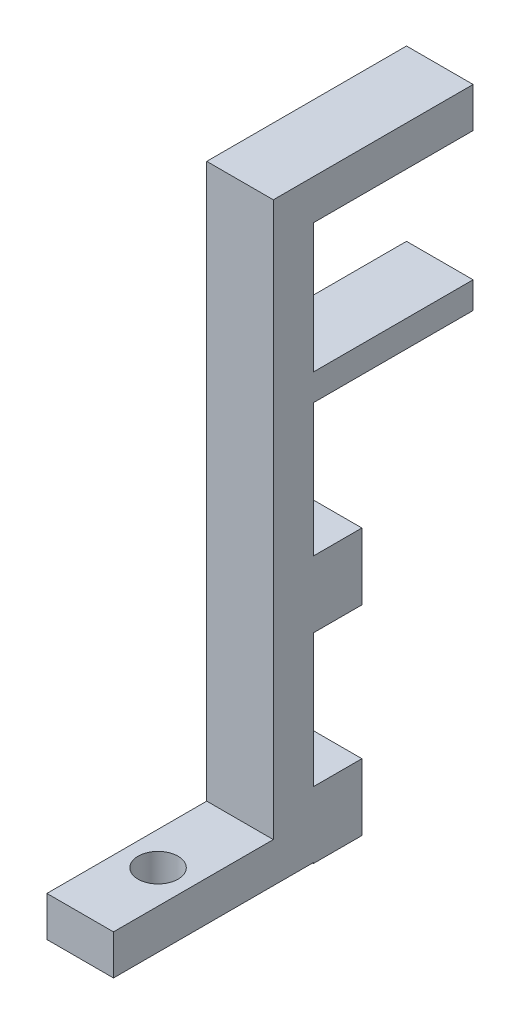
ISO-10303-21;
HEADER;
FILE_DESCRIPTION(('STEP AP214'),'2;1');
FILE_NAME('part.step','',(''),(''),'','','');
FILE_SCHEMA(('AUTOMOTIVE_DESIGN { 1 0 10303 214 1 1 1 1 }'));
ENDSEC;
DATA;
#1=APPLICATION_CONTEXT('core data for automotive mechanical design processes');
#2=APPLICATION_PROTOCOL_DEFINITION('international standard','automotive_design',2000,#1);
#3=PRODUCT_CONTEXT('',#1,'mechanical');
#4=PRODUCT('Part','Part','',(#3));
#5=PRODUCT_RELATED_PRODUCT_CATEGORY('part','',(#4));
#6=PRODUCT_DEFINITION_FORMATION('','',#4);
#7=PRODUCT_DEFINITION_CONTEXT('part definition',#1,'design');
#8=PRODUCT_DEFINITION('design','',#6,#7);
#9=PRODUCT_DEFINITION_SHAPE('','',#8);
#10=(LENGTH_UNIT() NAMED_UNIT(*) SI_UNIT(.MILLI.,.METRE.));
#11=(NAMED_UNIT(*) PLANE_ANGLE_UNIT() SI_UNIT($,.RADIAN.));
#12=(NAMED_UNIT(*) SI_UNIT($,.STERADIAN.) SOLID_ANGLE_UNIT());
#13=UNCERTAINTY_MEASURE_WITH_UNIT(LENGTH_MEASURE(1.E-05),#10,'distance_accuracy_value','');
#14=(GEOMETRIC_REPRESENTATION_CONTEXT(3) GLOBAL_UNCERTAINTY_ASSIGNED_CONTEXT((#13)) GLOBAL_UNIT_ASSIGNED_CONTEXT((#10,
#11,#12)) REPRESENTATION_CONTEXT('',''));
#15=CARTESIAN_POINT('',(0.,0.,0.));
#16=DIRECTION('',(0.,0.,1.));
#17=DIRECTION('',(1.,0.,0.));
#18=AXIS2_PLACEMENT_3D('',#15,#16,#17);
#19=CARTESIAN_POINT('',(0.,0.,0.));
#20=DIRECTION('',(0.,0.,1.));
#21=DIRECTION('',(1.,0.,0.));
#22=AXIS2_PLACEMENT_3D('',#19,#20,#21);
#23=PLANE('',#22);
#24=DIRECTION('',(1.,0.,0.));
#25=VECTOR('',#24,1.);
#26=CARTESIAN_POINT('',(2.5,-17.3642505571034,0.));
#27=LINE('',#26,#25);
#28=CARTESIAN_POINT('',(-2.5,-17.3642505571034,0.));
#29=VERTEX_POINT('',#28);
#30=CARTESIAN_POINT('',(2.5,-17.3642505571034,0.));
#31=VERTEX_POINT('',#30);
#32=EDGE_CURVE('E183',#29,#31,#27,.T.);
#33=ORIENTED_EDGE('',*,*,#32,.F.);
#34=DIRECTION('',(0.,-1.,0.));
#35=VECTOR('',#34,1.);
#36=CARTESIAN_POINT('',(-2.5,-19.3,0.));
#37=LINE('',#36,#35);
#38=CARTESIAN_POINT('',(-2.5,-7.36425055710344,0.));
#39=VERTEX_POINT('',#38);
#40=EDGE_CURVE('E219',#39,#29,#37,.T.);
#41=ORIENTED_EDGE('',*,*,#40,.F.);
#42=DIRECTION('',(-1.,0.,0.));
#43=VECTOR('',#42,1.);
#44=CARTESIAN_POINT('',(2.5,-7.36425055710344,0.));
#45=LINE('',#44,#43);
#46=CARTESIAN_POINT('',(2.5,-7.36425055710344,0.));
#47=VERTEX_POINT('',#46);
#48=EDGE_CURVE('E208',#47,#39,#45,.T.);
#49=ORIENTED_EDGE('',*,*,#48,.F.);
#50=DIRECTION('',(0.,1.,0.));
#51=VECTOR('',#50,1.);
#52=CARTESIAN_POINT('',(2.5,-19.3,0.));
#53=LINE('',#52,#51);
#54=EDGE_CURVE('E201',#31,#47,#53,.T.);
#55=ORIENTED_EDGE('',*,*,#54,.F.);
#56=EDGE_LOOP('',(#33,#41,#49,#55));
#57=FACE_BOUND('',#56,.T.);
#58=ADVANCED_FACE('F44',(#57),#23,.F.);
#59=DIRECTION('',(1.,0.,0.));
#60=VECTOR('',#59,1.);
#61=CARTESIAN_POINT('',(2.5,-2.36425055710344,0.));
#62=LINE('',#61,#60);
#63=CARTESIAN_POINT('',(-2.5,-2.36425055710344,0.));
#64=VERTEX_POINT('',#63);
#65=CARTESIAN_POINT('',(2.5,-2.36425055710344,0.));
#66=VERTEX_POINT('',#65);
#67=EDGE_CURVE('E408',#64,#66,#62,.T.);
#68=ORIENTED_EDGE('',*,*,#67,.F.);
#69=CARTESIAN_POINT('',(-2.5,7.6,0.));
#70=VERTEX_POINT('',#69);
#71=EDGE_CURVE('E218',#70,#64,#37,.T.);
#72=ORIENTED_EDGE('',*,*,#71,.F.);
#73=DIRECTION('',(-1.,0.,0.));
#74=VECTOR('',#73,1.);
#75=CARTESIAN_POINT('',(-2.5,7.6,0.));
#76=LINE('',#75,#74);
#77=CARTESIAN_POINT('',(2.5,7.6,0.));
#78=VERTEX_POINT('',#77);
#79=EDGE_CURVE('E328',#78,#70,#76,.T.);
#80=ORIENTED_EDGE('',*,*,#79,.F.);
#81=EDGE_CURVE('E210',#66,#78,#53,.T.);
#82=ORIENTED_EDGE('',*,*,#81,.F.);
#83=EDGE_LOOP('',(#68,#72,#80,#82));
#84=FACE_BOUND('',#83,.T.);
#85=ADVANCED_FACE('F311',(#84),#23,.F.);
#86=DIRECTION('',(1.,0.,0.));
#87=VECTOR('',#86,1.);
#88=CARTESIAN_POINT('',(-2.5,9.6,0.));
#89=LINE('',#88,#87);
#90=CARTESIAN_POINT('',(-2.5,9.6,0.));
#91=VERTEX_POINT('',#90);
#92=CARTESIAN_POINT('',(2.5,9.6,0.));
#93=VERTEX_POINT('',#92);
#94=EDGE_CURVE('E325',#91,#93,#89,.T.);
#95=ORIENTED_EDGE('',*,*,#94,.F.);
#96=CARTESIAN_POINT('',(-2.5,19.3,0.));
#97=VERTEX_POINT('',#96);
#98=EDGE_CURVE('E215',#97,#91,#37,.T.);
#99=ORIENTED_EDGE('',*,*,#98,.F.);
#100=DIRECTION('',(-1.,0.,0.));
#101=VECTOR('',#100,1.);
#102=CARTESIAN_POINT('',(2.5,19.3,0.));
#103=LINE('',#102,#101);
#104=CARTESIAN_POINT('',(2.5,19.3,0.));
#105=VERTEX_POINT('',#104);
#106=EDGE_CURVE('E209',#105,#97,#103,.T.);
#107=ORIENTED_EDGE('',*,*,#106,.F.);
#108=EDGE_CURVE('E69',#93,#105,#53,.T.);
#109=ORIENTED_EDGE('',*,*,#108,.F.);
#110=EDGE_LOOP('',(#95,#99,#107,#109));
#111=FACE_BOUND('',#110,.T.);
#112=ADVANCED_FACE('F313',(#111),#23,.F.);
#113=CARTESIAN_POINT('',(-2.5,-19.3,3.));
#114=DIRECTION('',(1.,0.,0.));
#115=DIRECTION('',(0.,0.,-1.));
#116=AXIS2_PLACEMENT_3D('',#113,#114,#115);
#117=PLANE('',#116);
#118=ORIENTED_EDGE('',*,*,#98,.T.);
#119=DIRECTION('',(0.,0.,1.));
#120=VECTOR('',#119,1.);
#121=CARTESIAN_POINT('',(-2.5,9.6,-12.));
#122=LINE('',#121,#120);
#123=CARTESIAN_POINT('',(-2.5,9.6,-12.));
#124=VERTEX_POINT('',#123);
#125=EDGE_CURVE('E270',#124,#91,#122,.T.);
#126=ORIENTED_EDGE('',*,*,#125,.F.);
#127=DIRECTION('',(0.,1.,0.));
#128=VECTOR('',#127,1.);
#129=CARTESIAN_POINT('',(-2.5,7.6,-12.));
#130=LINE('',#129,#128);
#131=CARTESIAN_POINT('',(-2.5,7.6,-12.));
#132=VERTEX_POINT('',#131);
#133=EDGE_CURVE('E332',#132,#124,#130,.T.);
#134=ORIENTED_EDGE('',*,*,#133,.F.);
#135=DIRECTION('',(0.,0.,1.));
#136=VECTOR('',#135,1.);
#137=CARTESIAN_POINT('',(-2.5,7.6,-12.));
#138=LINE('',#137,#136);
#139=EDGE_CURVE('E340',#132,#70,#138,.T.);
#140=ORIENTED_EDGE('',*,*,#139,.T.);
#141=ORIENTED_EDGE('',*,*,#71,.T.);
#142=DIRECTION('',(0.,0.,1.));
#143=VECTOR('',#142,1.);
#144=CARTESIAN_POINT('',(-2.5,-2.36425055710344,-3.65));
#145=LINE('',#144,#143);
#146=CARTESIAN_POINT('',(-2.5,-2.36425055710344,-3.65));
#147=VERTEX_POINT('',#146);
#148=EDGE_CURVE('E417',#147,#64,#145,.T.);
#149=ORIENTED_EDGE('',*,*,#148,.F.);
#150=DIRECTION('',(0.,1.,0.));
#151=VECTOR('',#150,1.);
#152=CARTESIAN_POINT('',(-2.5,-2.36425055710344,-3.65));
#153=LINE('',#152,#151);
#154=CARTESIAN_POINT('',(-2.5,-7.36425055710344,-3.65));
#155=VERTEX_POINT('',#154);
#156=EDGE_CURVE('E410',#155,#147,#153,.T.);
#157=ORIENTED_EDGE('',*,*,#156,.F.);
#158=DIRECTION('',(0.,0.,1.));
#159=VECTOR('',#158,1.);
#160=CARTESIAN_POINT('',(-2.5,-7.36425055710344,-3.65));
#161=LINE('',#160,#159);
#162=EDGE_CURVE('E334',#155,#39,#161,.T.);
#163=ORIENTED_EDGE('',*,*,#162,.T.);
#164=ORIENTED_EDGE('',*,*,#40,.T.);
#165=DIRECTION('',(0.,0.,1.));
#166=VECTOR('',#165,1.);
#167=CARTESIAN_POINT('',(-2.5,-17.3642505571034,-3.65));
#168=LINE('',#167,#166);
#169=CARTESIAN_POINT('',(-2.5,-17.3642505571034,-3.65));
#170=VERTEX_POINT('',#169);
#171=EDGE_CURVE('E190',#170,#29,#168,.T.);
#172=ORIENTED_EDGE('',*,*,#171,.F.);
#173=DIRECTION('',(0.,1.,0.));
#174=VECTOR('',#173,1.);
#175=CARTESIAN_POINT('',(-2.5,-17.3642505571034,-3.65));
#176=LINE('',#175,#174);
#177=CARTESIAN_POINT('',(-2.5,-22.3642505571034,-3.65));
#178=VERTEX_POINT('',#177);
#179=EDGE_CURVE('E400',#178,#170,#176,.T.);
#180=ORIENTED_EDGE('',*,*,#179,.F.);
#181=DIRECTION('',(0.,0.,1.));
#182=VECTOR('',#181,1.);
#183=CARTESIAN_POINT('',(-2.5,-22.3642505571034,-3.65));
#184=LINE('',#183,#182);
#185=CARTESIAN_POINT('',(-2.5,-22.3642505571034,0.));
#186=VERTEX_POINT('',#185);
#187=EDGE_CURVE('E393',#178,#186,#184,.T.);
#188=ORIENTED_EDGE('',*,*,#187,.T.);
#189=DIRECTION('',(0.,1.,0.));
#190=VECTOR('',#189,1.);
#191=CARTESIAN_POINT('',(-2.5,-17.3642505571034,0.));
#192=LINE('',#191,#190);
#193=CARTESIAN_POINT('',(-2.5,-22.3,0.));
#194=VERTEX_POINT('',#193);
#195=EDGE_CURVE('E195',#186,#194,#192,.T.);
#196=ORIENTED_EDGE('',*,*,#195,.T.);
#197=DIRECTION('',(0.,0.,-1.));
#198=VECTOR('',#197,1.);
#199=CARTESIAN_POINT('',(-2.5,-22.3,0.));
#200=LINE('',#199,#198);
#201=CARTESIAN_POINT('',(-2.5,-22.3,15.));
#202=VERTEX_POINT('',#201);
#203=EDGE_CURVE('E280',#202,#194,#200,.T.);
#204=ORIENTED_EDGE('',*,*,#203,.F.);
#205=DIRECTION('',(0.,1.,0.));
#206=VECTOR('',#205,1.);
#207=CARTESIAN_POINT('',(-2.5,-22.3,15.));
#208=LINE('',#207,#206);
#209=CARTESIAN_POINT('',(-2.5,-19.3,15.));
#210=VERTEX_POINT('',#209);
#211=EDGE_CURVE('E228',#202,#210,#208,.T.);
#212=ORIENTED_EDGE('',*,*,#211,.T.);
#213=DIRECTION('',(0.,0.,-1.));
#214=VECTOR('',#213,1.);
#215=CARTESIAN_POINT('',(-2.5,-19.3,0.));
#216=LINE('',#215,#214);
#217=CARTESIAN_POINT('',(-2.5,-19.3,3.));
#218=VERTEX_POINT('',#217);
#219=EDGE_CURVE('E290',#210,#218,#216,.T.);
#220=ORIENTED_EDGE('',*,*,#219,.T.);
#221=DIRECTION('',(0.,-1.,0.));
#222=VECTOR('',#221,1.);
#223=CARTESIAN_POINT('',(-2.5,-19.3,3.));
#224=LINE('',#223,#222);
#225=CARTESIAN_POINT('',(-2.5,22.3,3.));
#226=VERTEX_POINT('',#225);
#227=EDGE_CURVE('E213',#226,#218,#224,.T.);
#228=ORIENTED_EDGE('',*,*,#227,.F.);
#229=DIRECTION('',(0.,0.,1.));
#230=VECTOR('',#229,1.);
#231=CARTESIAN_POINT('',(-2.5,22.3,3.));
#232=LINE('',#231,#230);
#233=CARTESIAN_POINT('',(-2.5,22.3,-12.));
#234=VERTEX_POINT('',#233);
#235=EDGE_CURVE('E263',#234,#226,#232,.T.);
#236=ORIENTED_EDGE('',*,*,#235,.F.);
#237=DIRECTION('',(0.,-1.,0.));
#238=VECTOR('',#237,1.);
#239=CARTESIAN_POINT('',(-2.5,22.3,-12.));
#240=LINE('',#239,#238);
#241=CARTESIAN_POINT('',(-2.5,19.3,-12.));
#242=VERTEX_POINT('',#241);
#243=EDGE_CURVE('E261',#234,#242,#240,.T.);
#244=ORIENTED_EDGE('',*,*,#243,.T.);
#245=DIRECTION('',(0.,0.,1.));
#246=VECTOR('',#245,1.);
#247=CARTESIAN_POINT('',(-2.5,19.3,3.));
#248=LINE('',#247,#246);
#249=EDGE_CURVE('E267',#242,#97,#248,.T.);
#250=ORIENTED_EDGE('',*,*,#249,.T.);
#251=EDGE_LOOP('',(#118,#126,#134,#140,#141,#149,#157,#163,#164,#172,#180,#188,#196,#204,#212,
#220,#228,#236,#244,#250));
#252=FACE_BOUND('',#251,.T.);
#253=ADVANCED_FACE('F46',(#252),#117,.F.);
#254=CARTESIAN_POINT('',(2.5,-19.3,3.));
#255=DIRECTION('',(-1.,0.,0.));
#256=DIRECTION('',(0.,0.,1.));
#257=AXIS2_PLACEMENT_3D('',#254,#255,#256);
#258=PLANE('',#257);
#259=DIRECTION('',(0.,0.,1.));
#260=VECTOR('',#259,1.);
#261=CARTESIAN_POINT('',(2.5,-22.3,0.));
#262=LINE('',#261,#260);
#263=CARTESIAN_POINT('',(2.5,-22.3,0.));
#264=VERTEX_POINT('',#263);
#265=CARTESIAN_POINT('',(2.5,-22.3,15.));
#266=VERTEX_POINT('',#265);
#267=EDGE_CURVE('E287',#264,#266,#262,.T.);
#268=ORIENTED_EDGE('',*,*,#267,.F.);
#269=DIRECTION('',(0.,-1.,0.));
#270=VECTOR('',#269,1.);
#271=CARTESIAN_POINT('',(2.5,-17.3642505571034,0.));
#272=LINE('',#271,#270);
#273=CARTESIAN_POINT('',(2.5,-22.3642505571034,0.));
#274=VERTEX_POINT('',#273);
#275=EDGE_CURVE('E378',#264,#274,#272,.T.);
#276=ORIENTED_EDGE('',*,*,#275,.T.);
#277=DIRECTION('',(0.,0.,1.));
#278=VECTOR('',#277,1.);
#279=CARTESIAN_POINT('',(2.5,-22.3642505571034,-3.65));
#280=LINE('',#279,#278);
#281=CARTESIAN_POINT('',(2.5,-22.3642505571034,-3.65));
#282=VERTEX_POINT('',#281);
#283=EDGE_CURVE('E381',#282,#274,#280,.T.);
#284=ORIENTED_EDGE('',*,*,#283,.F.);
#285=DIRECTION('',(0.,-1.,0.));
#286=VECTOR('',#285,1.);
#287=CARTESIAN_POINT('',(2.5,-17.3642505571034,-3.65));
#288=LINE('',#287,#286);
#289=CARTESIAN_POINT('',(2.5,-17.3642505571034,-3.65));
#290=VERTEX_POINT('',#289);
#291=EDGE_CURVE('E196',#290,#282,#288,.T.);
#292=ORIENTED_EDGE('',*,*,#291,.F.);
#293=DIRECTION('',(0.,0.,1.));
#294=VECTOR('',#293,1.);
#295=CARTESIAN_POINT('',(2.5,-17.3642505571034,-3.65));
#296=LINE('',#295,#294);
#297=EDGE_CURVE('E187',#290,#31,#296,.T.);
#298=ORIENTED_EDGE('',*,*,#297,.T.);
#299=ORIENTED_EDGE('',*,*,#54,.T.);
#300=DIRECTION('',(0.,0.,1.));
#301=VECTOR('',#300,1.);
#302=CARTESIAN_POINT('',(2.5,-7.36425055710344,-3.65));
#303=LINE('',#302,#301);
#304=CARTESIAN_POINT('',(2.5,-7.36425055710344,-3.65));
#305=VERTEX_POINT('',#304);
#306=EDGE_CURVE('E329',#305,#47,#303,.T.);
#307=ORIENTED_EDGE('',*,*,#306,.F.);
#308=DIRECTION('',(0.,-1.,0.));
#309=VECTOR('',#308,1.);
#310=CARTESIAN_POINT('',(2.5,-2.36425055710344,-3.65));
#311=LINE('',#310,#309);
#312=CARTESIAN_POINT('',(2.5,-2.36425055710344,-3.65));
#313=VERTEX_POINT('',#312);
#314=EDGE_CURVE('E404',#313,#305,#311,.T.);
#315=ORIENTED_EDGE('',*,*,#314,.F.);
#316=DIRECTION('',(0.,0.,1.));
#317=VECTOR('',#316,1.);
#318=CARTESIAN_POINT('',(2.5,-2.36425055710344,-3.65));
#319=LINE('',#318,#317);
#320=EDGE_CURVE('E61',#313,#66,#319,.T.);
#321=ORIENTED_EDGE('',*,*,#320,.T.);
#322=ORIENTED_EDGE('',*,*,#81,.T.);
#323=DIRECTION('',(0.,0.,1.));
#324=VECTOR('',#323,1.);
#325=CARTESIAN_POINT('',(2.5,7.6,-12.));
#326=LINE('',#325,#324);
#327=CARTESIAN_POINT('',(2.5,7.6,-12.));
#328=VERTEX_POINT('',#327);
#329=EDGE_CURVE('E343',#328,#78,#326,.T.);
#330=ORIENTED_EDGE('',*,*,#329,.F.);
#331=DIRECTION('',(0.,-1.,0.));
#332=VECTOR('',#331,1.);
#333=CARTESIAN_POINT('',(2.5,7.6,-12.));
#334=LINE('',#333,#332);
#335=CARTESIAN_POINT('',(2.5,9.6,-12.));
#336=VERTEX_POINT('',#335);
#337=EDGE_CURVE('E423',#336,#328,#334,.T.);
#338=ORIENTED_EDGE('',*,*,#337,.F.);
#339=DIRECTION('',(0.,0.,1.));
#340=VECTOR('',#339,1.);
#341=CARTESIAN_POINT('',(2.5,9.6,-12.));
#342=LINE('',#341,#340);
#343=EDGE_CURVE('E346',#336,#93,#342,.T.);
#344=ORIENTED_EDGE('',*,*,#343,.T.);
#345=ORIENTED_EDGE('',*,*,#108,.T.);
#346=DIRECTION('',(0.,0.,-1.));
#347=VECTOR('',#346,1.);
#348=CARTESIAN_POINT('',(2.5,19.3,3.));
#349=LINE('',#348,#347);
#350=CARTESIAN_POINT('',(2.5,19.3,-12.));
#351=VERTEX_POINT('',#350);
#352=EDGE_CURVE('E269',#105,#351,#349,.T.);
#353=ORIENTED_EDGE('',*,*,#352,.T.);
#354=DIRECTION('',(0.,-1.,0.));
#355=VECTOR('',#354,1.);
#356=CARTESIAN_POINT('',(2.5,22.3,-12.));
#357=LINE('',#356,#355);
#358=CARTESIAN_POINT('',(2.5,22.3,-12.));
#359=VERTEX_POINT('',#358);
#360=EDGE_CURVE('E255',#359,#351,#357,.T.);
#361=ORIENTED_EDGE('',*,*,#360,.F.);
#362=DIRECTION('',(0.,0.,-1.));
#363=VECTOR('',#362,1.);
#364=CARTESIAN_POINT('',(2.5,22.3,3.));
#365=LINE('',#364,#363);
#366=CARTESIAN_POINT('',(2.5,22.3,3.));
#367=VERTEX_POINT('',#366);
#368=EDGE_CURVE('E253',#367,#359,#365,.T.);
#369=ORIENTED_EDGE('',*,*,#368,.F.);
#370=DIRECTION('',(0.,1.,0.));
#371=VECTOR('',#370,1.);
#372=CARTESIAN_POINT('',(2.5,-19.3,3.));
#373=LINE('',#372,#371);
#374=CARTESIAN_POINT('',(2.5,-19.3,3.));
#375=VERTEX_POINT('',#374);
#376=EDGE_CURVE('E11',#375,#367,#373,.T.);
#377=ORIENTED_EDGE('',*,*,#376,.F.);
#378=DIRECTION('',(0.,0.,1.));
#379=VECTOR('',#378,1.);
#380=CARTESIAN_POINT('',(2.5,-19.3,0.));
#381=LINE('',#380,#379);
#382=CARTESIAN_POINT('',(2.5,-19.3,15.));
#383=VERTEX_POINT('',#382);
#384=EDGE_CURVE('E251',#375,#383,#381,.T.);
#385=ORIENTED_EDGE('',*,*,#384,.T.);
#386=DIRECTION('',(0.,1.,0.));
#387=VECTOR('',#386,1.);
#388=CARTESIAN_POINT('',(2.5,-22.3,15.));
#389=LINE('',#388,#387);
#390=EDGE_CURVE('E225',#266,#383,#389,.T.);
#391=ORIENTED_EDGE('',*,*,#390,.F.);
#392=EDGE_LOOP('',(#268,#276,#284,#292,#298,#299,#307,#315,#321,#322,#330,#338,#344,#345,#353,
#361,#369,#377,#385,#391));
#393=FACE_BOUND('',#392,.T.);
#394=ADVANCED_FACE('F199',(#393),#258,.F.);
#395=CARTESIAN_POINT('',(0.,0.,3.));
#396=DIRECTION('',(0.,0.,1.));
#397=DIRECTION('',(1.,0.,0.));
#398=AXIS2_PLACEMENT_3D('',#395,#396,#397);
#399=PLANE('',#398);
#400=ORIENTED_EDGE('',*,*,#227,.T.);
#401=DIRECTION('',(1.,0.,0.));
#402=VECTOR('',#401,1.);
#403=CARTESIAN_POINT('',(2.5,-19.3,3.));
#404=LINE('',#403,#402);
#405=EDGE_CURVE('E53',#218,#375,#404,.T.);
#406=ORIENTED_EDGE('',*,*,#405,.T.);
#407=ORIENTED_EDGE('',*,*,#376,.T.);
#408=DIRECTION('',(1.,0.,0.));
#409=VECTOR('',#408,1.);
#410=CARTESIAN_POINT('',(-2.5,22.3,3.));
#411=LINE('',#410,#409);
#412=EDGE_CURVE('E259',#226,#367,#411,.T.);
#413=ORIENTED_EDGE('',*,*,#412,.F.);
#414=EDGE_LOOP('',(#400,#406,#407,#413));
#415=FACE_BOUND('',#414,.T.);
#416=ADVANCED_FACE('F244',(#415),#399,.T.);
#417=CARTESIAN_POINT('',(0.,-19.3,0.));
#418=DIRECTION('',(0.,1.,0.));
#419=DIRECTION('',(0.,0.,1.));
#420=AXIS2_PLACEMENT_3D('',#417,#418,#419);
#421=PLANE('',#420);
#422=CARTESIAN_POINT('',(0.,-19.3,9.15321030372945));
#423=DIRECTION('',(0.,1.,0.));
#424=DIRECTION('',(0.,0.,1.));
#425=AXIS2_PLACEMENT_3D('',#422,#423,#424);
#426=CIRCLE('',#425,1.5);
#427=CARTESIAN_POINT('',(0.,-19.3,10.6532103037294));
#428=VERTEX_POINT('',#427);
#429=EDGE_CURVE('E277',#428,#428,#426,.T.);
#430=ORIENTED_EDGE('',*,*,#429,.F.);
#431=EDGE_LOOP('',(#430));
#432=FACE_BOUND('',#431,.T.);
#433=ORIENTED_EDGE('',*,*,#405,.F.);
#434=ORIENTED_EDGE('',*,*,#219,.F.);
#435=DIRECTION('',(-1.,0.,0.));
#436=VECTOR('',#435,1.);
#437=CARTESIAN_POINT('',(-2.5,-19.3,15.));
#438=LINE('',#437,#436);
#439=EDGE_CURVE('E284',#383,#210,#438,.T.);
#440=ORIENTED_EDGE('',*,*,#439,.F.);
#441=ORIENTED_EDGE('',*,*,#384,.F.);
#442=EDGE_LOOP('',(#433,#434,#440,#441));
#443=FACE_BOUND('',#442,.T.);
#444=ADVANCED_FACE('F296',(#432,#443),#421,.T.);
#445=CARTESIAN_POINT('',(-2.5,-22.3,15.));
#446=DIRECTION('',(0.,0.,-1.));
#447=DIRECTION('',(-1.,0.,0.));
#448=AXIS2_PLACEMENT_3D('',#445,#446,#447);
#449=PLANE('',#448);
#450=ORIENTED_EDGE('',*,*,#439,.T.);
#451=ORIENTED_EDGE('',*,*,#211,.F.);
#452=DIRECTION('',(-1.,0.,0.));
#453=VECTOR('',#452,1.);
#454=CARTESIAN_POINT('',(-2.5,-22.3,15.));
#455=LINE('',#454,#453);
#456=EDGE_CURVE('E235',#266,#202,#455,.T.);
#457=ORIENTED_EDGE('',*,*,#456,.F.);
#458=ORIENTED_EDGE('',*,*,#390,.T.);
#459=EDGE_LOOP('',(#450,#451,#457,#458));
#460=FACE_BOUND('',#459,.T.);
#461=ADVANCED_FACE('F293',(#460),#449,.F.);
#462=CARTESIAN_POINT('',(0.,-22.3,0.));
#463=DIRECTION('',(0.,1.,0.));
#464=DIRECTION('',(0.,0.,1.));
#465=AXIS2_PLACEMENT_3D('',#462,#463,#464);
#466=PLANE('',#465);
#467=CARTESIAN_POINT('',(0.,-22.3,9.15321030372945));
#468=DIRECTION('',(0.,1.,0.));
#469=DIRECTION('',(0.,0.,1.));
#470=AXIS2_PLACEMENT_3D('',#467,#468,#469);
#471=CIRCLE('',#470,1.5);
#472=CARTESIAN_POINT('',(0.,-22.3,10.6532103037294));
#473=VERTEX_POINT('',#472);
#474=EDGE_CURVE('E48',#473,#473,#471,.T.);
#475=ORIENTED_EDGE('',*,*,#474,.T.);
#476=EDGE_LOOP('',(#475));
#477=FACE_BOUND('',#476,.T.);
#478=ORIENTED_EDGE('',*,*,#203,.T.);
#479=DIRECTION('',(1.,0.,0.));
#480=VECTOR('',#479,1.);
#481=CARTESIAN_POINT('',(-2.5,-22.3,0.));
#482=LINE('',#481,#480);
#483=EDGE_CURVE('E283',#194,#264,#482,.T.);
#484=ORIENTED_EDGE('',*,*,#483,.T.);
#485=ORIENTED_EDGE('',*,*,#267,.T.);
#486=ORIENTED_EDGE('',*,*,#456,.T.);
#487=EDGE_LOOP('',(#478,#484,#485,#486));
#488=FACE_BOUND('',#487,.T.);
#489=ADVANCED_FACE('F304',(#477,#488),#466,.F.);
#490=CARTESIAN_POINT('',(0.,-23.3,9.15321030372945));
#491=DIRECTION('',(0.,1.,0.));
#492=DIRECTION('',(0.,0.,1.));
#493=AXIS2_PLACEMENT_3D('',#490,#491,#492);
#494=CYLINDRICAL_SURFACE('',#493,1.5);
#495=ORIENTED_EDGE('',*,*,#429,.T.);
#496=EDGE_LOOP('',(#495));
#497=FACE_BOUND('',#496,.T.);
#498=ORIENTED_EDGE('',*,*,#474,.F.);
#499=EDGE_LOOP('',(#498));
#500=FACE_BOUND('',#499,.T.);
#501=ADVANCED_FACE('F360',(#497,#500),#494,.F.);
#502=CARTESIAN_POINT('',(-2.5,22.3,-12.));
#503=DIRECTION('',(0.,0.,1.));
#504=DIRECTION('',(1.,0.,0.));
#505=AXIS2_PLACEMENT_3D('',#502,#503,#504);
#506=PLANE('',#505);
#507=DIRECTION('',(-1.,0.,0.));
#508=VECTOR('',#507,1.);
#509=CARTESIAN_POINT('',(-2.5,19.3,-12.));
#510=LINE('',#509,#508);
#511=EDGE_CURVE('E272',#351,#242,#510,.T.);
#512=ORIENTED_EDGE('',*,*,#511,.T.);
#513=ORIENTED_EDGE('',*,*,#243,.F.);
#514=DIRECTION('',(-1.,0.,0.));
#515=VECTOR('',#514,1.);
#516=CARTESIAN_POINT('',(-2.5,22.3,-12.));
#517=LINE('',#516,#515);
#518=EDGE_CURVE('E258',#359,#234,#517,.T.);
#519=ORIENTED_EDGE('',*,*,#518,.F.);
#520=ORIENTED_EDGE('',*,*,#360,.T.);
#521=EDGE_LOOP('',(#512,#513,#519,#520));
#522=FACE_BOUND('',#521,.T.);
#523=ADVANCED_FACE('F358',(#522),#506,.F.);
#524=CARTESIAN_POINT('',(0.,22.3,0.));
#525=DIRECTION('',(0.,-1.,0.));
#526=DIRECTION('',(0.,0.,-1.));
#527=AXIS2_PLACEMENT_3D('',#524,#525,#526);
#528=PLANE('',#527);
#529=ORIENTED_EDGE('',*,*,#235,.T.);
#530=ORIENTED_EDGE('',*,*,#412,.T.);
#531=ORIENTED_EDGE('',*,*,#368,.T.);
#532=ORIENTED_EDGE('',*,*,#518,.T.);
#533=EDGE_LOOP('',(#529,#530,#531,#532));
#534=FACE_BOUND('',#533,.T.);
#535=ADVANCED_FACE('F350',(#534),#528,.F.);
#536=CARTESIAN_POINT('',(0.,19.3,0.));
#537=DIRECTION('',(0.,-1.,0.));
#538=DIRECTION('',(0.,0.,-1.));
#539=AXIS2_PLACEMENT_3D('',#536,#537,#538);
#540=PLANE('',#539);
#541=ORIENTED_EDGE('',*,*,#352,.F.);
#542=ORIENTED_EDGE('',*,*,#106,.T.);
#543=ORIENTED_EDGE('',*,*,#249,.F.);
#544=ORIENTED_EDGE('',*,*,#511,.F.);
#545=EDGE_LOOP('',(#541,#542,#543,#544));
#546=FACE_BOUND('',#545,.T.);
#547=ADVANCED_FACE('F357',(#546),#540,.T.);
#548=CARTESIAN_POINT('',(-2.5,9.6,-12.));
#549=DIRECTION('',(0.,-1.,0.));
#550=DIRECTION('',(1.,0.,0.));
#551=AXIS2_PLACEMENT_3D('',#548,#549,#550);
#552=PLANE('',#551);
#553=ORIENTED_EDGE('',*,*,#94,.T.);
#554=ORIENTED_EDGE('',*,*,#343,.F.);
#555=DIRECTION('',(1.,0.,0.));
#556=VECTOR('',#555,1.);
#557=CARTESIAN_POINT('',(-2.5,9.6,-12.));
#558=LINE('',#557,#556);
#559=EDGE_CURVE('E422',#124,#336,#558,.T.);
#560=ORIENTED_EDGE('',*,*,#559,.F.);
#561=ORIENTED_EDGE('',*,*,#125,.T.);
#562=EDGE_LOOP('',(#553,#554,#560,#561));
#563=FACE_BOUND('',#562,.T.);
#564=ADVANCED_FACE('F434',(#563),#552,.F.);
#565=CARTESIAN_POINT('',(-2.5,7.6,-12.));
#566=DIRECTION('',(0.,1.,0.));
#567=DIRECTION('',(0.,0.,1.));
#568=AXIS2_PLACEMENT_3D('',#565,#566,#567);
#569=PLANE('',#568);
#570=ORIENTED_EDGE('',*,*,#79,.T.);
#571=ORIENTED_EDGE('',*,*,#139,.F.);
#572=DIRECTION('',(-1.,0.,0.));
#573=VECTOR('',#572,1.);
#574=CARTESIAN_POINT('',(-2.5,7.6,-12.));
#575=LINE('',#574,#573);
#576=EDGE_CURVE('E337',#328,#132,#575,.T.);
#577=ORIENTED_EDGE('',*,*,#576,.F.);
#578=ORIENTED_EDGE('',*,*,#329,.T.);
#579=EDGE_LOOP('',(#570,#571,#577,#578));
#580=FACE_BOUND('',#579,.T.);
#581=ADVANCED_FACE('F432',(#580),#569,.F.);
#582=CARTESIAN_POINT('',(0.,0.,-12.));
#583=DIRECTION('',(0.,0.,-1.));
#584=DIRECTION('',(-1.,0.,0.));
#585=AXIS2_PLACEMENT_3D('',#582,#583,#584);
#586=PLANE('',#585);
#587=ORIENTED_EDGE('',*,*,#133,.T.);
#588=ORIENTED_EDGE('',*,*,#559,.T.);
#589=ORIENTED_EDGE('',*,*,#337,.T.);
#590=ORIENTED_EDGE('',*,*,#576,.T.);
#591=EDGE_LOOP('',(#587,#588,#589,#590));
#592=FACE_BOUND('',#591,.T.);
#593=ADVANCED_FACE('F429',(#592),#586,.T.);
#594=CARTESIAN_POINT('',(2.5,-7.36425055710344,-3.65));
#595=DIRECTION('',(0.,1.,0.));
#596=DIRECTION('',(0.,0.,1.));
#597=AXIS2_PLACEMENT_3D('',#594,#595,#596);
#598=PLANE('',#597);
#599=ORIENTED_EDGE('',*,*,#48,.T.);
#600=ORIENTED_EDGE('',*,*,#162,.F.);
#601=DIRECTION('',(-1.,0.,0.));
#602=VECTOR('',#601,1.);
#603=CARTESIAN_POINT('',(2.5,-7.36425055710344,-3.65));
#604=LINE('',#603,#602);
#605=EDGE_CURVE('E407',#305,#155,#604,.T.);
#606=ORIENTED_EDGE('',*,*,#605,.F.);
#607=ORIENTED_EDGE('',*,*,#306,.T.);
#608=EDGE_LOOP('',(#599,#600,#606,#607));
#609=FACE_BOUND('',#608,.T.);
#610=ADVANCED_FACE('F446',(#609),#598,.F.);
#611=CARTESIAN_POINT('',(2.5,-2.36425055710344,-3.65));
#612=DIRECTION('',(0.,-1.,0.));
#613=DIRECTION('',(0.,0.,-1.));
#614=AXIS2_PLACEMENT_3D('',#611,#612,#613);
#615=PLANE('',#614);
#616=ORIENTED_EDGE('',*,*,#67,.T.);
#617=ORIENTED_EDGE('',*,*,#320,.F.);
#618=DIRECTION('',(1.,0.,0.));
#619=VECTOR('',#618,1.);
#620=CARTESIAN_POINT('',(2.5,-2.36425055710344,-3.65));
#621=LINE('',#620,#619);
#622=EDGE_CURVE('E412',#147,#313,#621,.T.);
#623=ORIENTED_EDGE('',*,*,#622,.F.);
#624=ORIENTED_EDGE('',*,*,#148,.T.);
#625=EDGE_LOOP('',(#616,#617,#623,#624));
#626=FACE_BOUND('',#625,.T.);
#627=ADVANCED_FACE('F441',(#626),#615,.F.);
#628=CARTESIAN_POINT('',(0.,0.,-3.65));
#629=DIRECTION('',(0.,0.,-1.));
#630=DIRECTION('',(-1.,0.,0.));
#631=AXIS2_PLACEMENT_3D('',#628,#629,#630);
#632=PLANE('',#631);
#633=ORIENTED_EDGE('',*,*,#314,.T.);
#634=ORIENTED_EDGE('',*,*,#605,.T.);
#635=ORIENTED_EDGE('',*,*,#156,.T.);
#636=ORIENTED_EDGE('',*,*,#622,.T.);
#637=EDGE_LOOP('',(#633,#634,#635,#636));
#638=FACE_BOUND('',#637,.T.);
#639=ADVANCED_FACE('F443',(#638),#632,.T.);
#640=CARTESIAN_POINT('',(0.,0.,0.));
#641=DIRECTION('',(0.,0.,-1.));
#642=DIRECTION('',(-1.,0.,0.));
#643=AXIS2_PLACEMENT_3D('',#640,#641,#642);
#644=PLANE('',#643);
#645=ORIENTED_EDGE('',*,*,#275,.F.);
#646=ORIENTED_EDGE('',*,*,#483,.F.);
#647=ORIENTED_EDGE('',*,*,#195,.F.);
#648=DIRECTION('',(-1.,0.,0.));
#649=VECTOR('',#648,1.);
#650=CARTESIAN_POINT('',(2.5,-22.3642505571034,0.));
#651=LINE('',#650,#649);
#652=EDGE_CURVE('E383',#274,#186,#651,.T.);
#653=ORIENTED_EDGE('',*,*,#652,.F.);
#654=EDGE_LOOP('',(#645,#646,#647,#653));
#655=FACE_BOUND('',#654,.T.);
#656=ADVANCED_FACE('F386',(#655),#644,.F.);
#657=CARTESIAN_POINT('',(2.5,-22.3642505571034,-3.65));
#658=DIRECTION('',(0.,1.,0.));
#659=DIRECTION('',(0.,0.,1.));
#660=AXIS2_PLACEMENT_3D('',#657,#658,#659);
#661=PLANE('',#660);
#662=ORIENTED_EDGE('',*,*,#652,.T.);
#663=ORIENTED_EDGE('',*,*,#187,.F.);
#664=DIRECTION('',(-1.,0.,0.));
#665=VECTOR('',#664,1.);
#666=CARTESIAN_POINT('',(2.5,-22.3642505571034,-3.65));
#667=LINE('',#666,#665);
#668=EDGE_CURVE('E392',#282,#178,#667,.T.);
#669=ORIENTED_EDGE('',*,*,#668,.F.);
#670=ORIENTED_EDGE('',*,*,#283,.T.);
#671=EDGE_LOOP('',(#662,#663,#669,#670));
#672=FACE_BOUND('',#671,.T.);
#673=ADVANCED_FACE('F391',(#672),#661,.F.);
#674=CARTESIAN_POINT('',(2.5,-17.3642505571034,-3.65));
#675=DIRECTION('',(0.,-1.,0.));
#676=DIRECTION('',(0.,0.,-1.));
#677=AXIS2_PLACEMENT_3D('',#674,#675,#676);
#678=PLANE('',#677);
#679=ORIENTED_EDGE('',*,*,#32,.T.);
#680=ORIENTED_EDGE('',*,*,#297,.F.);
#681=DIRECTION('',(1.,0.,0.));
#682=VECTOR('',#681,1.);
#683=CARTESIAN_POINT('',(2.5,-17.3642505571034,-3.65));
#684=LINE('',#683,#682);
#685=EDGE_CURVE('E205',#170,#290,#684,.T.);
#686=ORIENTED_EDGE('',*,*,#685,.F.);
#687=ORIENTED_EDGE('',*,*,#171,.T.);
#688=EDGE_LOOP('',(#679,#680,#686,#687));
#689=FACE_BOUND('',#688,.T.);
#690=ADVANCED_FACE('F185',(#689),#678,.F.);
#691=CARTESIAN_POINT('',(0.,0.,-3.65));
#692=DIRECTION('',(0.,0.,-1.));
#693=DIRECTION('',(-1.,0.,0.));
#694=AXIS2_PLACEMENT_3D('',#691,#692,#693);
#695=PLANE('',#694);
#696=ORIENTED_EDGE('',*,*,#291,.T.);
#697=ORIENTED_EDGE('',*,*,#668,.T.);
#698=ORIENTED_EDGE('',*,*,#179,.T.);
#699=ORIENTED_EDGE('',*,*,#685,.T.);
#700=EDGE_LOOP('',(#696,#697,#698,#699));
#701=FACE_BOUND('',#700,.T.);
#702=ADVANCED_FACE('F604',(#701),#695,.T.);
#703=CLOSED_SHELL('',(#58,#85,#112,#253,#394,#416,#444,#461,#489,#501,#523,#535,#547,#564,#581,
#593,#610,#627,#639,#656,#673,#690,#702));
#704=MANIFOLD_SOLID_BREP('B2',#703);
#705=ADVANCED_BREP_SHAPE_REPRESENTATION('',(#18,#704),#14);
#706=SHAPE_DEFINITION_REPRESENTATION(#9,#705);
ENDSEC;
END-ISO-10303-21;
